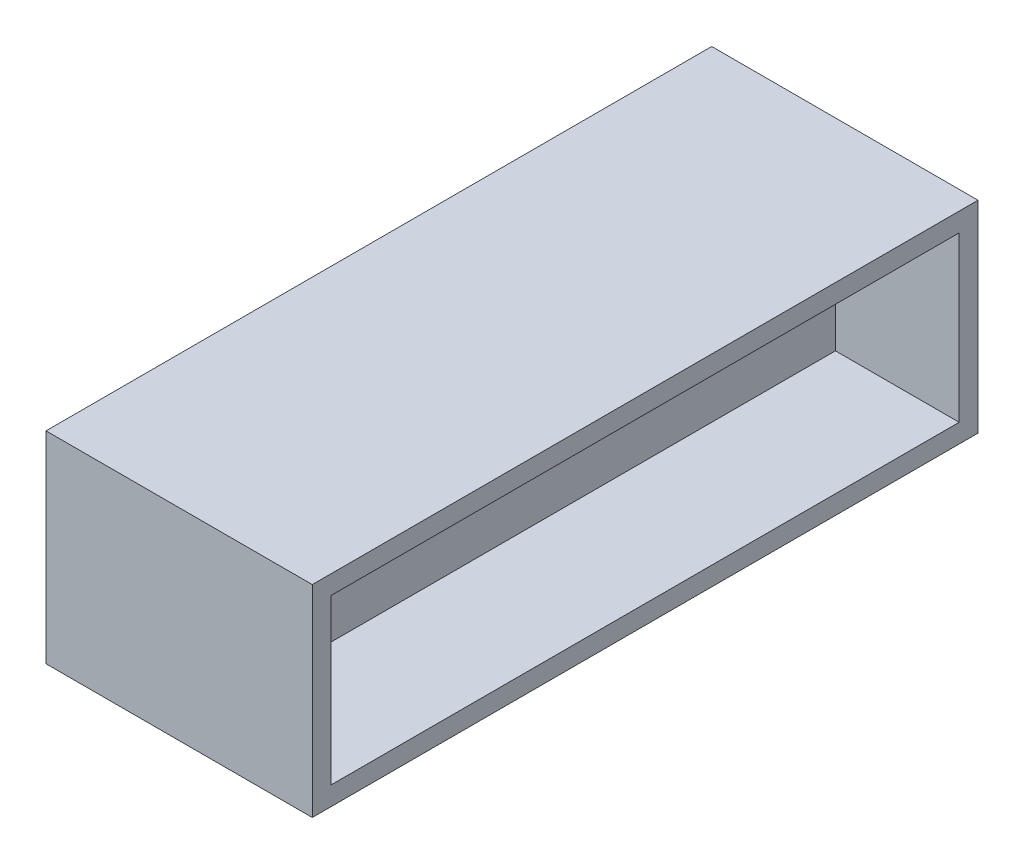
ISO-10303-21;
HEADER;
FILE_DESCRIPTION(('STEP AP214'),'2;1');
FILE_NAME('part.step','',(''),(''),'','','');
FILE_SCHEMA(('AUTOMOTIVE_DESIGN { 1 0 10303 214 1 1 1 1 }'));
ENDSEC;
DATA;
#1=APPLICATION_CONTEXT('core data for automotive mechanical design processes');
#2=APPLICATION_PROTOCOL_DEFINITION('international standard','automotive_design',2000,#1);
#3=PRODUCT_CONTEXT('',#1,'mechanical');
#4=PRODUCT('Part','Part','',(#3));
#5=PRODUCT_RELATED_PRODUCT_CATEGORY('part','',(#4));
#6=PRODUCT_DEFINITION_FORMATION('','',#4);
#7=PRODUCT_DEFINITION_CONTEXT('part definition',#1,'design');
#8=PRODUCT_DEFINITION('design','',#6,#7);
#9=PRODUCT_DEFINITION_SHAPE('','',#8);
#10=(LENGTH_UNIT() NAMED_UNIT(*) SI_UNIT(.MILLI.,.METRE.));
#11=(NAMED_UNIT(*) PLANE_ANGLE_UNIT() SI_UNIT($,.RADIAN.));
#12=(NAMED_UNIT(*) SI_UNIT($,.STERADIAN.) SOLID_ANGLE_UNIT());
#13=UNCERTAINTY_MEASURE_WITH_UNIT(LENGTH_MEASURE(1.E-05),#10,'distance_accuracy_value','');
#14=(GEOMETRIC_REPRESENTATION_CONTEXT(3) GLOBAL_UNCERTAINTY_ASSIGNED_CONTEXT((#13)) GLOBAL_UNIT_ASSIGNED_CONTEXT((#10,
#11,#12)) REPRESENTATION_CONTEXT('',''));
#15=CARTESIAN_POINT('',(0.,0.,0.));
#16=DIRECTION('',(0.,0.,1.));
#17=DIRECTION('',(1.,0.,0.));
#18=AXIS2_PLACEMENT_3D('',#15,#16,#17);
#19=CARTESIAN_POINT('',(0.,0.,3.));
#20=DIRECTION('',(0.,0.,-1.));
#21=DIRECTION('',(-1.,0.,0.));
#22=AXIS2_PLACEMENT_3D('',#19,#20,#21);
#23=PLANE('',#22);
#24=DIRECTION('',(0.,-1.,0.));
#25=VECTOR('',#24,1.);
#26=CARTESIAN_POINT('',(-21.2,-16.06,3.));
#27=LINE('',#26,#25);
#28=CARTESIAN_POINT('',(-21.2,13.06,3.));
#29=VERTEX_POINT('',#28);
#30=CARTESIAN_POINT('',(-21.2,-13.06,3.));
#31=VERTEX_POINT('',#30);
#32=EDGE_CURVE('E214',#29,#31,#27,.T.);
#33=ORIENTED_EDGE('',*,*,#32,.T.);
#34=DIRECTION('',(1.,0.,0.));
#35=VECTOR('',#34,1.);
#36=CARTESIAN_POINT('',(-21.2,-13.06,3.));
#37=LINE('',#36,#35);
#38=CARTESIAN_POINT('',(-1.5,-13.06,3.));
#39=VERTEX_POINT('',#38);
#40=EDGE_CURVE('E54',#31,#39,#37,.T.);
#41=ORIENTED_EDGE('',*,*,#40,.T.);
#42=DIRECTION('',(0.,1.,0.));
#43=VECTOR('',#42,1.);
#44=CARTESIAN_POINT('',(-1.5,0.,3.));
#45=LINE('',#44,#43);
#46=CARTESIAN_POINT('',(-1.5,13.06,3.));
#47=VERTEX_POINT('',#46);
#48=EDGE_CURVE('E58',#39,#47,#45,.T.);
#49=ORIENTED_EDGE('',*,*,#48,.T.);
#50=DIRECTION('',(1.,0.,0.));
#51=VECTOR('',#50,1.);
#52=CARTESIAN_POINT('',(0.,13.06,3.));
#53=LINE('',#52,#51);
#54=EDGE_CURVE('E181',#29,#47,#53,.T.);
#55=ORIENTED_EDGE('',*,*,#54,.F.);
#56=EDGE_LOOP('',(#33,#41,#49,#55));
#57=FACE_BOUND('',#56,.T.);
#58=ADVANCED_FACE('F37',(#57),#23,.F.);
#59=CARTESIAN_POINT('',(21.2,-16.06,3.));
#60=DIRECTION('',(-1.,0.,0.));
#61=DIRECTION('',(0.,0.,1.));
#62=AXIS2_PLACEMENT_3D('',#59,#60,#61);
#63=PLANE('',#62);
#64=DIRECTION('',(0.,0.,-1.));
#65=VECTOR('',#64,1.);
#66=CARTESIAN_POINT('',(21.2,-13.06,103.));
#67=LINE('',#66,#65);
#68=CARTESIAN_POINT('',(21.2,-13.06,103.));
#69=VERTEX_POINT('',#68);
#70=CARTESIAN_POINT('',(21.2,-13.06,3.));
#71=VERTEX_POINT('',#70);
#72=EDGE_CURVE('E179',#69,#71,#67,.T.);
#73=ORIENTED_EDGE('',*,*,#72,.F.);
#74=DIRECTION('',(0.,1.,0.));
#75=VECTOR('',#74,1.);
#76=CARTESIAN_POINT('',(21.2,-16.06,103.));
#77=LINE('',#76,#75);
#78=CARTESIAN_POINT('',(21.2,13.06,103.));
#79=VERTEX_POINT('',#78);
#80=EDGE_CURVE('E153',#69,#79,#77,.T.);
#81=ORIENTED_EDGE('',*,*,#80,.T.);
#82=DIRECTION('',(0.,0.,-1.));
#83=VECTOR('',#82,1.);
#84=CARTESIAN_POINT('',(21.2,13.06,103.));
#85=LINE('',#84,#83);
#86=CARTESIAN_POINT('',(21.2,13.06,3.));
#87=VERTEX_POINT('',#86);
#88=EDGE_CURVE('E195',#79,#87,#85,.T.);
#89=ORIENTED_EDGE('',*,*,#88,.T.);
#90=DIRECTION('',(0.,1.,0.));
#91=VECTOR('',#90,1.);
#92=CARTESIAN_POINT('',(21.2,-16.06,3.));
#93=LINE('',#92,#91);
#94=EDGE_CURVE('E213',#71,#87,#93,.T.);
#95=ORIENTED_EDGE('',*,*,#94,.F.);
#96=EDGE_LOOP('',(#73,#81,#89,#95));
#97=FACE_BOUND('',#96,.T.);
#98=DIRECTION('',(0.,1.,0.));
#99=VECTOR('',#98,1.);
#100=CARTESIAN_POINT('',(21.2,-16.06,0.));
#101=LINE('',#100,#99);
#102=CARTESIAN_POINT('',(21.2,-16.06,0.));
#103=VERTEX_POINT('',#102);
#104=CARTESIAN_POINT('',(21.2,16.06,0.));
#105=VERTEX_POINT('',#104);
#106=EDGE_CURVE('E205',#103,#105,#101,.T.);
#107=ORIENTED_EDGE('',*,*,#106,.T.);
#108=DIRECTION('',(0.,0.,-1.));
#109=VECTOR('',#108,1.);
#110=CARTESIAN_POINT('',(21.2,16.06,3.));
#111=LINE('',#110,#109);
#112=CARTESIAN_POINT('',(21.2,16.06,106.));
#113=VERTEX_POINT('',#112);
#114=EDGE_CURVE('E11',#113,#105,#111,.T.);
#115=ORIENTED_EDGE('',*,*,#114,.F.);
#116=DIRECTION('',(0.,1.,0.));
#117=VECTOR('',#116,1.);
#118=CARTESIAN_POINT('',(21.2,-16.06,106.));
#119=LINE('',#118,#117);
#120=CARTESIAN_POINT('',(21.2,-16.06,106.));
#121=VERTEX_POINT('',#120);
#122=EDGE_CURVE('E150',#121,#113,#119,.T.);
#123=ORIENTED_EDGE('',*,*,#122,.F.);
#124=DIRECTION('',(0.,0.,-1.));
#125=VECTOR('',#124,1.);
#126=CARTESIAN_POINT('',(21.2,-16.06,3.));
#127=LINE('',#126,#125);
#128=EDGE_CURVE('E140',#121,#103,#127,.T.);
#129=ORIENTED_EDGE('',*,*,#128,.T.);
#130=EDGE_LOOP('',(#107,#115,#123,#129));
#131=FACE_BOUND('',#130,.T.);
#132=ADVANCED_FACE('F45',(#97,#131),#63,.F.);
#133=CARTESIAN_POINT('',(-21.2,16.06,3.));
#134=DIRECTION('',(0.,-1.,0.));
#135=DIRECTION('',(0.,0.,-1.));
#136=AXIS2_PLACEMENT_3D('',#133,#134,#135);
#137=PLANE('',#136);
#138=DIRECTION('',(-1.,0.,0.));
#139=VECTOR('',#138,1.);
#140=CARTESIAN_POINT('',(-21.2,16.06,0.));
#141=LINE('',#140,#139);
#142=CARTESIAN_POINT('',(-21.2,16.06,0.));
#143=VERTEX_POINT('',#142);
#144=EDGE_CURVE('E219',#105,#143,#141,.T.);
#145=ORIENTED_EDGE('',*,*,#144,.T.);
#146=DIRECTION('',(0.,0.,-1.));
#147=VECTOR('',#146,1.);
#148=CARTESIAN_POINT('',(-21.2,16.06,3.));
#149=LINE('',#148,#147);
#150=CARTESIAN_POINT('',(-21.2,16.06,106.));
#151=VERTEX_POINT('',#150);
#152=EDGE_CURVE('E48',#151,#143,#149,.T.);
#153=ORIENTED_EDGE('',*,*,#152,.F.);
#154=DIRECTION('',(-1.,0.,0.));
#155=VECTOR('',#154,1.);
#156=CARTESIAN_POINT('',(-21.2,16.06,106.));
#157=LINE('',#156,#155);
#158=EDGE_CURVE('E155',#113,#151,#157,.T.);
#159=ORIENTED_EDGE('',*,*,#158,.F.);
#160=ORIENTED_EDGE('',*,*,#114,.T.);
#161=EDGE_LOOP('',(#145,#153,#159,#160));
#162=FACE_BOUND('',#161,.T.);
#163=ADVANCED_FACE('F226',(#162),#137,.F.);
#164=CARTESIAN_POINT('',(-21.2,-16.06,3.));
#165=DIRECTION('',(1.,0.,0.));
#166=DIRECTION('',(0.,0.,-1.));
#167=AXIS2_PLACEMENT_3D('',#164,#165,#166);
#168=PLANE('',#167);
#169=DIRECTION('',(0.,-1.,0.));
#170=VECTOR('',#169,1.);
#171=CARTESIAN_POINT('',(-21.2,-16.06,103.));
#172=LINE('',#171,#170);
#173=CARTESIAN_POINT('',(-21.2,13.06,103.));
#174=VERTEX_POINT('',#173);
#175=CARTESIAN_POINT('',(-21.2,-13.06,103.));
#176=VERTEX_POINT('',#175);
#177=EDGE_CURVE('E156',#174,#176,#172,.T.);
#178=ORIENTED_EDGE('',*,*,#177,.T.);
#179=DIRECTION('',(0.,0.,-1.));
#180=VECTOR('',#179,1.);
#181=CARTESIAN_POINT('',(-21.2,-13.06,103.));
#182=LINE('',#181,#180);
#183=EDGE_CURVE('E206',#176,#31,#182,.T.);
#184=ORIENTED_EDGE('',*,*,#183,.T.);
#185=ORIENTED_EDGE('',*,*,#32,.F.);
#186=DIRECTION('',(0.,0.,-1.));
#187=VECTOR('',#186,1.);
#188=CARTESIAN_POINT('',(-21.2,13.06,103.));
#189=LINE('',#188,#187);
#190=EDGE_CURVE('E188',#174,#29,#189,.T.);
#191=ORIENTED_EDGE('',*,*,#190,.F.);
#192=EDGE_LOOP('',(#178,#184,#185,#191));
#193=FACE_BOUND('',#192,.T.);
#194=DIRECTION('',(0.,-1.,0.));
#195=VECTOR('',#194,1.);
#196=CARTESIAN_POINT('',(-21.2,-16.06,0.));
#197=LINE('',#196,#195);
#198=CARTESIAN_POINT('',(-21.2,-16.06,0.));
#199=VERTEX_POINT('',#198);
#200=EDGE_CURVE('E133',#143,#199,#197,.T.);
#201=ORIENTED_EDGE('',*,*,#200,.T.);
#202=DIRECTION('',(0.,0.,-1.));
#203=VECTOR('',#202,1.);
#204=CARTESIAN_POINT('',(-21.2,-16.06,3.));
#205=LINE('',#204,#203);
#206=CARTESIAN_POINT('',(-21.2,-16.06,106.));
#207=VERTEX_POINT('',#206);
#208=EDGE_CURVE('E126',#207,#199,#205,.T.);
#209=ORIENTED_EDGE('',*,*,#208,.F.);
#210=DIRECTION('',(0.,-1.,0.));
#211=VECTOR('',#210,1.);
#212=CARTESIAN_POINT('',(-21.2,-16.06,106.));
#213=LINE('',#212,#211);
#214=EDGE_CURVE('E134',#151,#207,#213,.T.);
#215=ORIENTED_EDGE('',*,*,#214,.F.);
#216=ORIENTED_EDGE('',*,*,#152,.T.);
#217=EDGE_LOOP('',(#201,#209,#215,#216));
#218=FACE_BOUND('',#217,.T.);
#219=ADVANCED_FACE('F128',(#193,#218),#168,.F.);
#220=CARTESIAN_POINT('',(-21.2,-16.06,3.));
#221=DIRECTION('',(0.,1.,0.));
#222=DIRECTION('',(-1.,0.,0.));
#223=AXIS2_PLACEMENT_3D('',#220,#221,#222);
#224=PLANE('',#223);
#225=DIRECTION('',(1.,0.,0.));
#226=VECTOR('',#225,1.);
#227=CARTESIAN_POINT('',(-21.2,-16.06,0.));
#228=LINE('',#227,#226);
#229=EDGE_CURVE('E216',#199,#103,#228,.T.);
#230=ORIENTED_EDGE('',*,*,#229,.T.);
#231=ORIENTED_EDGE('',*,*,#128,.F.);
#232=DIRECTION('',(1.,0.,0.));
#233=VECTOR('',#232,1.);
#234=CARTESIAN_POINT('',(-21.2,-16.06,106.));
#235=LINE('',#234,#233);
#236=EDGE_CURVE('E143',#207,#121,#235,.T.);
#237=ORIENTED_EDGE('',*,*,#236,.F.);
#238=ORIENTED_EDGE('',*,*,#208,.T.);
#239=EDGE_LOOP('',(#230,#231,#237,#238));
#240=FACE_BOUND('',#239,.T.);
#241=ADVANCED_FACE('F142',(#240),#224,.F.);
#242=DIRECTION('',(0.,1.,0.));
#243=VECTOR('',#242,1.);
#244=CARTESIAN_POINT('',(1.5,0.,3.));
#245=LINE('',#244,#243);
#246=CARTESIAN_POINT('',(1.5,-13.06,3.));
#247=VERTEX_POINT('',#246);
#248=CARTESIAN_POINT('',(1.5,13.06,3.));
#249=VERTEX_POINT('',#248);
#250=EDGE_CURVE('E176',#247,#249,#245,.T.);
#251=ORIENTED_EDGE('',*,*,#250,.F.);
#252=EDGE_CURVE('E161',#247,#71,#37,.T.);
#253=ORIENTED_EDGE('',*,*,#252,.T.);
#254=ORIENTED_EDGE('',*,*,#94,.T.);
#255=DIRECTION('',(1.,0.,0.));
#256=VECTOR('',#255,1.);
#257=CARTESIAN_POINT('',(0.,13.06,3.));
#258=LINE('',#257,#256);
#259=EDGE_CURVE('E178',#249,#87,#258,.T.);
#260=ORIENTED_EDGE('',*,*,#259,.F.);
#261=EDGE_LOOP('',(#251,#253,#254,#260));
#262=FACE_BOUND('',#261,.T.);
#263=ADVANCED_FACE('F238',(#262),#23,.F.);
#264=CARTESIAN_POINT('',(0.,0.,0.));
#265=DIRECTION('',(0.,0.,-1.));
#266=DIRECTION('',(-1.,0.,0.));
#267=AXIS2_PLACEMENT_3D('',#264,#265,#266);
#268=PLANE('',#267);
#269=ORIENTED_EDGE('',*,*,#106,.F.);
#270=ORIENTED_EDGE('',*,*,#229,.F.);
#271=ORIENTED_EDGE('',*,*,#200,.F.);
#272=ORIENTED_EDGE('',*,*,#144,.F.);
#273=EDGE_LOOP('',(#269,#270,#271,#272));
#274=FACE_BOUND('',#273,.T.);
#275=ADVANCED_FACE('F230',(#274),#268,.T.);
#276=CARTESIAN_POINT('',(1.5,0.,103.));
#277=DIRECTION('',(-1.,0.,0.));
#278=DIRECTION('',(0.,0.,1.));
#279=AXIS2_PLACEMENT_3D('',#276,#277,#278);
#280=PLANE('',#279);
#281=ORIENTED_EDGE('',*,*,#250,.T.);
#282=DIRECTION('',(0.,0.,-1.));
#283=VECTOR('',#282,1.);
#284=CARTESIAN_POINT('',(1.5,13.06,103.));
#285=LINE('',#284,#283);
#286=CARTESIAN_POINT('',(1.5,13.06,103.));
#287=VERTEX_POINT('',#286);
#288=EDGE_CURVE('E198',#287,#249,#285,.T.);
#289=ORIENTED_EDGE('',*,*,#288,.F.);
#290=DIRECTION('',(0.,1.,0.));
#291=VECTOR('',#290,1.);
#292=CARTESIAN_POINT('',(1.5,0.,103.));
#293=LINE('',#292,#291);
#294=CARTESIAN_POINT('',(1.5,-13.06,103.));
#295=VERTEX_POINT('',#294);
#296=EDGE_CURVE('E163',#295,#287,#293,.T.);
#297=ORIENTED_EDGE('',*,*,#296,.F.);
#298=DIRECTION('',(0.,0.,-1.));
#299=VECTOR('',#298,1.);
#300=CARTESIAN_POINT('',(1.5,-13.06,103.));
#301=LINE('',#300,#299);
#302=EDGE_CURVE('E200',#295,#247,#301,.T.);
#303=ORIENTED_EDGE('',*,*,#302,.T.);
#304=EDGE_LOOP('',(#281,#289,#297,#303));
#305=FACE_BOUND('',#304,.T.);
#306=ADVANCED_FACE('F247',(#305),#280,.F.);
#307=CARTESIAN_POINT('',(0.,13.06,103.));
#308=DIRECTION('',(0.,1.,0.));
#309=DIRECTION('',(0.,0.,1.));
#310=AXIS2_PLACEMENT_3D('',#307,#308,#309);
#311=PLANE('',#310);
#312=ORIENTED_EDGE('',*,*,#259,.T.);
#313=ORIENTED_EDGE('',*,*,#88,.F.);
#314=DIRECTION('',(1.,0.,0.));
#315=VECTOR('',#314,1.);
#316=CARTESIAN_POINT('',(0.,13.06,103.));
#317=LINE('',#316,#315);
#318=EDGE_CURVE('E170',#287,#79,#317,.T.);
#319=ORIENTED_EDGE('',*,*,#318,.F.);
#320=ORIENTED_EDGE('',*,*,#288,.T.);
#321=EDGE_LOOP('',(#312,#313,#319,#320));
#322=FACE_BOUND('',#321,.T.);
#323=ADVANCED_FACE('F266',(#322),#311,.F.);
#324=CARTESIAN_POINT('',(0.,13.06,103.));
#325=DIRECTION('',(0.,1.,0.));
#326=DIRECTION('',(0.,0.,1.));
#327=AXIS2_PLACEMENT_3D('',#324,#325,#326);
#328=PLANE('',#327);
#329=ORIENTED_EDGE('',*,*,#54,.T.);
#330=DIRECTION('',(0.,0.,-1.));
#331=VECTOR('',#330,1.);
#332=CARTESIAN_POINT('',(-1.5,13.06,103.));
#333=LINE('',#332,#331);
#334=CARTESIAN_POINT('',(-1.5,13.06,103.));
#335=VERTEX_POINT('',#334);
#336=EDGE_CURVE('E189',#335,#47,#333,.T.);
#337=ORIENTED_EDGE('',*,*,#336,.F.);
#338=DIRECTION('',(1.,0.,0.));
#339=VECTOR('',#338,1.);
#340=CARTESIAN_POINT('',(0.,13.06,103.));
#341=LINE('',#340,#339);
#342=EDGE_CURVE('E168',#174,#335,#341,.T.);
#343=ORIENTED_EDGE('',*,*,#342,.F.);
#344=ORIENTED_EDGE('',*,*,#190,.T.);
#345=EDGE_LOOP('',(#329,#337,#343,#344));
#346=FACE_BOUND('',#345,.T.);
#347=ADVANCED_FACE('F268',(#346),#328,.F.);
#348=CARTESIAN_POINT('',(-1.5,0.,103.));
#349=DIRECTION('',(-1.,0.,0.));
#350=DIRECTION('',(0.,0.,1.));
#351=AXIS2_PLACEMENT_3D('',#348,#349,#350);
#352=PLANE('',#351);
#353=ORIENTED_EDGE('',*,*,#48,.F.);
#354=DIRECTION('',(0.,0.,-1.));
#355=VECTOR('',#354,1.);
#356=CARTESIAN_POINT('',(-1.5,-13.06,103.));
#357=LINE('',#356,#355);
#358=CARTESIAN_POINT('',(-1.5,-13.06,103.));
#359=VERTEX_POINT('',#358);
#360=EDGE_CURVE('E173',#359,#39,#357,.T.);
#361=ORIENTED_EDGE('',*,*,#360,.F.);
#362=DIRECTION('',(0.,1.,0.));
#363=VECTOR('',#362,1.);
#364=CARTESIAN_POINT('',(-1.5,0.,103.));
#365=LINE('',#364,#363);
#366=EDGE_CURVE('E174',#359,#335,#365,.T.);
#367=ORIENTED_EDGE('',*,*,#366,.T.);
#368=ORIENTED_EDGE('',*,*,#336,.T.);
#369=EDGE_LOOP('',(#353,#361,#367,#368));
#370=FACE_BOUND('',#369,.T.);
#371=ADVANCED_FACE('F273',(#370),#352,.T.);
#372=CARTESIAN_POINT('',(-21.2,-13.06,103.));
#373=DIRECTION('',(0.,1.,0.));
#374=DIRECTION('',(0.,0.,1.));
#375=AXIS2_PLACEMENT_3D('',#372,#373,#374);
#376=PLANE('',#375);
#377=DIRECTION('',(1.,0.,0.));
#378=VECTOR('',#377,1.);
#379=CARTESIAN_POINT('',(-21.2,-13.06,103.));
#380=LINE('',#379,#378);
#381=EDGE_CURVE('E201',#176,#359,#380,.T.);
#382=ORIENTED_EDGE('',*,*,#381,.T.);
#383=ORIENTED_EDGE('',*,*,#360,.T.);
#384=ORIENTED_EDGE('',*,*,#40,.F.);
#385=ORIENTED_EDGE('',*,*,#183,.F.);
#386=EDGE_LOOP('',(#382,#383,#384,#385));
#387=FACE_BOUND('',#386,.T.);
#388=ADVANCED_FACE('F279',(#387),#376,.T.);
#389=ORIENTED_EDGE('',*,*,#302,.F.);
#390=EDGE_CURVE('E210',#295,#69,#380,.T.);
#391=ORIENTED_EDGE('',*,*,#390,.T.);
#392=ORIENTED_EDGE('',*,*,#72,.T.);
#393=ORIENTED_EDGE('',*,*,#252,.F.);
#394=EDGE_LOOP('',(#389,#391,#392,#393));
#395=FACE_BOUND('',#394,.T.);
#396=ADVANCED_FACE('F253',(#395),#376,.T.);
#397=CARTESIAN_POINT('',(0.,0.,103.));
#398=DIRECTION('',(0.,0.,-1.));
#399=DIRECTION('',(-1.,0.,0.));
#400=AXIS2_PLACEMENT_3D('',#397,#398,#399);
#401=PLANE('',#400);
#402=ORIENTED_EDGE('',*,*,#390,.F.);
#403=ORIENTED_EDGE('',*,*,#296,.T.);
#404=ORIENTED_EDGE('',*,*,#318,.T.);
#405=ORIENTED_EDGE('',*,*,#80,.F.);
#406=EDGE_LOOP('',(#402,#403,#404,#405));
#407=FACE_BOUND('',#406,.T.);
#408=ADVANCED_FACE('F263',(#407),#401,.T.);
#409=ORIENTED_EDGE('',*,*,#381,.F.);
#410=ORIENTED_EDGE('',*,*,#177,.F.);
#411=ORIENTED_EDGE('',*,*,#342,.T.);
#412=ORIENTED_EDGE('',*,*,#366,.F.);
#413=EDGE_LOOP('',(#409,#410,#411,#412));
#414=FACE_BOUND('',#413,.T.);
#415=ADVANCED_FACE('F292',(#414),#401,.T.);
#416=CARTESIAN_POINT('',(0.,0.,106.));
#417=DIRECTION('',(0.,0.,-1.));
#418=DIRECTION('',(-1.,0.,0.));
#419=AXIS2_PLACEMENT_3D('',#416,#417,#418);
#420=PLANE('',#419);
#421=ORIENTED_EDGE('',*,*,#214,.T.);
#422=ORIENTED_EDGE('',*,*,#236,.T.);
#423=ORIENTED_EDGE('',*,*,#122,.T.);
#424=ORIENTED_EDGE('',*,*,#158,.T.);
#425=EDGE_LOOP('',(#421,#422,#423,#424));
#426=FACE_BOUND('',#425,.T.);
#427=ADVANCED_FACE('F147',(#426),#420,.F.);
#428=CLOSED_SHELL('',(#58,#132,#163,#219,#241,#263,#275,#306,#323,#347,#371,#388,#396,#408,#415,#427));
#429=MANIFOLD_SOLID_BREP('B2',#428);
#430=ADVANCED_BREP_SHAPE_REPRESENTATION('',(#18,#429),#14);
#431=SHAPE_DEFINITION_REPRESENTATION(#9,#430);
ENDSEC;
END-ISO-10303-21;
